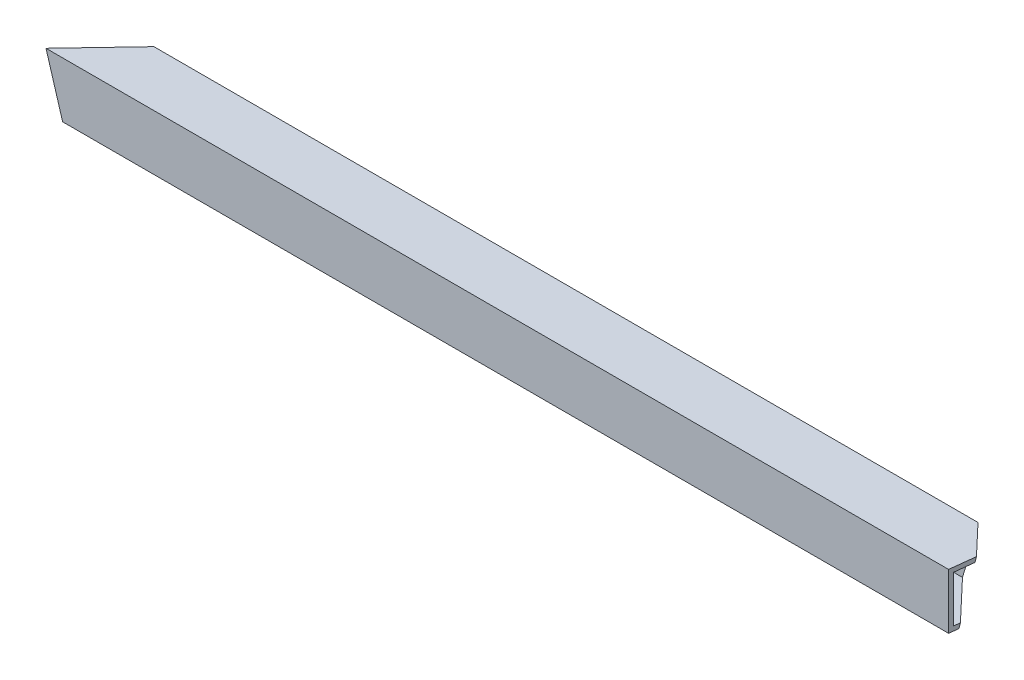
ISO-10303-21;
HEADER;
FILE_DESCRIPTION(('STEP AP214'),'2;1');
FILE_NAME('part.step','',(''),(''),'','','');
FILE_SCHEMA(('AUTOMOTIVE_DESIGN { 1 0 10303 214 1 1 1 1 }'));
ENDSEC;
DATA;
#1=APPLICATION_CONTEXT('core data for automotive mechanical design processes');
#2=APPLICATION_PROTOCOL_DEFINITION('international standard','automotive_design',2000,#1);
#3=PRODUCT_CONTEXT('',#1,'mechanical');
#4=PRODUCT('Part','Part','',(#3));
#5=PRODUCT_RELATED_PRODUCT_CATEGORY('part','',(#4));
#6=PRODUCT_DEFINITION_FORMATION('','',#4);
#7=PRODUCT_DEFINITION_CONTEXT('part definition',#1,'design');
#8=PRODUCT_DEFINITION('design','',#6,#7);
#9=PRODUCT_DEFINITION_SHAPE('','',#8);
#10=(LENGTH_UNIT() NAMED_UNIT(*) SI_UNIT(.MILLI.,.METRE.));
#11=(NAMED_UNIT(*) PLANE_ANGLE_UNIT() SI_UNIT($,.RADIAN.));
#12=(NAMED_UNIT(*) SI_UNIT($,.STERADIAN.) SOLID_ANGLE_UNIT());
#13=UNCERTAINTY_MEASURE_WITH_UNIT(LENGTH_MEASURE(1.E-05),#10,'distance_accuracy_value','');
#14=(GEOMETRIC_REPRESENTATION_CONTEXT(3) GLOBAL_UNCERTAINTY_ASSIGNED_CONTEXT((#13)) GLOBAL_UNIT_ASSIGNED_CONTEXT((#10,
#11,#12)) REPRESENTATION_CONTEXT('',''));
#15=CARTESIAN_POINT('',(0.,0.,0.));
#16=DIRECTION('',(0.,0.,1.));
#17=DIRECTION('',(1.,0.,0.));
#18=AXIS2_PLACEMENT_3D('',#15,#16,#17);
#19=CARTESIAN_POINT('',(-169.428571428572,-8.39999999999994,-986.599999999999));
#20=DIRECTION('',(0.,0.,-1.));
#21=DIRECTION('',(-1.,0.,0.));
#22=AXIS2_PLACEMENT_3D('',#19,#20,#21);
#23=PLANE('',#22);
#24=DIRECTION('',(1.,0.,0.));
#25=VECTOR('',#24,1.);
#26=CARTESIAN_POINT('',(-169.428571428572,8.40000000000004,-986.599999999999));
#27=LINE('',#26,#25);
#28=CARTESIAN_POINT('',(-165.813474674315,8.40000000000031,-986.599999999999));
#29=VERTEX_POINT('',#28);
#30=CARTESIAN_POINT('',(158.403477169252,8.4,-986.599999999999));
#31=VERTEX_POINT('',#30);
#32=EDGE_CURVE('E171',#29,#31,#27,.T.);
#33=ORIENTED_EDGE('',*,*,#32,.T.);
#34=DIRECTION('',(0.,-1.,0.));
#35=VECTOR('',#34,1.);
#36=CARTESIAN_POINT('',(158.403477169252,-8.39999999999994,-986.599999999999));
#37=LINE('',#36,#35);
#38=CARTESIAN_POINT('',(158.403477169252,-8.39999999999999,-986.599999999999));
#39=VERTEX_POINT('',#38);
#40=EDGE_CURVE('E202',#31,#39,#37,.T.);
#41=ORIENTED_EDGE('',*,*,#40,.T.);
#42=DIRECTION('',(1.,0.,0.));
#43=VECTOR('',#42,1.);
#44=CARTESIAN_POINT('',(-169.428571428572,-8.39999999999994,-986.599999999999));
#45=LINE('',#44,#43);
#46=CARTESIAN_POINT('',(-160.767070284621,-8.39999999999994,-986.599999999999));
#47=VERTEX_POINT('',#46);
#48=EDGE_CURVE('E167',#47,#39,#45,.T.);
#49=ORIENTED_EDGE('',*,*,#48,.F.);
#50=DIRECTION('',(-0.287682820424566,0.957725740926162,0.));
#51=VECTOR('',#50,1.);
#52=CARTESIAN_POINT('',(-161.483908290154,-6.01357244426472,-986.599999999999));
#53=LINE('',#52,#51);
#54=EDGE_CURVE('E142',#47,#29,#53,.T.);
#55=ORIENTED_EDGE('',*,*,#54,.T.);
#56=EDGE_LOOP('',(#33,#41,#49,#55));
#57=FACE_BOUND('',#56,.T.);
#58=ADVANCED_FACE('F41',(#57),#23,.T.);
#59=CARTESIAN_POINT('',(-169.428571428572,-8.39999999999994,-986.599999999999));
#60=DIRECTION('',(0.,1.,0.));
#61=DIRECTION('',(0.,0.,1.));
#62=AXIS2_PLACEMENT_3D('',#59,#60,#61);
#63=PLANE('',#62);
#64=ORIENTED_EDGE('',*,*,#48,.T.);
#65=DIRECTION('',(0.113546591160732,0.,-0.993532672656404));
#66=VECTOR('',#65,1.);
#67=CARTESIAN_POINT('',(154.176794834389,-8.39999999999993,-949.616529569947));
#68=LINE('',#67,#66);
#69=CARTESIAN_POINT('',(158.657556191653,-8.39999999999999,-988.823191446012));
#70=VERTEX_POINT('',#69);
#71=EDGE_CURVE('E134',#39,#70,#68,.T.);
#72=ORIENTED_EDGE('',*,*,#71,.T.);
#73=DIRECTION('',(-0.688317522845565,0.,-0.725409531053835));
#74=VECTOR('',#73,1.);
#75=CARTESIAN_POINT('',(4.32664491114096,-8.40000000000024,-1151.47067645596));
#76=LINE('',#75,#74);
#77=CARTESIAN_POINT('',(144.826096408793,-8.40000000000028,-1003.4));
#78=VERTEX_POINT('',#77);
#79=EDGE_CURVE('E132',#70,#78,#76,.T.);
#80=ORIENTED_EDGE('',*,*,#79,.T.);
#81=DIRECTION('',(1.,0.,0.));
#82=VECTOR('',#81,1.);
#83=CARTESIAN_POINT('',(-169.428571428572,-8.39999999999996,-1003.4));
#84=LINE('',#83,#82);
#85=CARTESIAN_POINT('',(-144.826096408794,-8.39999999999997,-1003.4));
#86=VERTEX_POINT('',#85);
#87=EDGE_CURVE('E164',#86,#78,#84,.T.);
#88=ORIENTED_EDGE('',*,*,#87,.F.);
#89=DIRECTION('',(-0.688317522845566,0.,0.725409531053835));
#90=VECTOR('',#89,1.);
#91=CARTESIAN_POINT('',(-164.870725064261,-8.39999999999993,-982.275207748599));
#92=LINE('',#91,#90);
#93=EDGE_CURVE('E177',#86,#47,#92,.T.);
#94=ORIENTED_EDGE('',*,*,#93,.T.);
#95=EDGE_LOOP('',(#64,#72,#80,#88,#94));
#96=FACE_BOUND('',#95,.T.);
#97=ADVANCED_FACE('F204',(#96),#63,.T.);
#98=CARTESIAN_POINT('',(164.469825921124,-6.31448757724577,-983.357917298473));
#99=DIRECTION('',(0.708778209555372,-0.212903658810694,-0.672536602516547));
#100=DIRECTION('',(-0.688317522845565,0.,-0.725409531053836));
#101=AXIS2_PLACEMENT_3D('',#98,#99,#100);
#102=PLANE('',#101);
#103=ORIENTED_EDGE('',*,*,#79,.F.);
#104=DIRECTION('',(-0.0310586126136646,-0.961862937380512,0.271762860369564));
#105=VECTOR('',#104,1.);
#106=CARTESIAN_POINT('',(158.679335720857,-7.72550361489242,-989.013762326542));
#107=LINE('',#106,#105);
#108=CARTESIAN_POINT('',(158.605892094566,-10.,-988.371130596495));
#109=VERTEX_POINT('',#108);
#110=EDGE_CURVE('E119',#70,#109,#107,.T.);
#111=ORIENTED_EDGE('',*,*,#110,.T.);
#112=DIRECTION('',(-0.688317522845565,0.,-0.725409531053836));
#113=VECTOR('',#112,1.);
#114=CARTESIAN_POINT('',(4.8726381803694,-9.99999999999998,-1150.38875172031));
#115=LINE('',#114,#113);
#116=CARTESIAN_POINT('',(142.827298478744,-10.,-1005.));
#117=VERTEX_POINT('',#116);
#118=EDGE_CURVE('E130',#109,#117,#115,.T.);
#119=ORIENTED_EDGE('',*,*,#118,.T.);
#120=DIRECTION('',(0.287682820424565,0.957725740926163,0.));
#121=VECTOR('',#120,1.);
#122=CARTESIAN_POINT('',(116.984563913435,-96.0331252057093,-1005.));
#123=LINE('',#122,#121);
#124=CARTESIAN_POINT('',(148.834922752189,10.,-1005.));
#125=VERTEX_POINT('',#124);
#126=EDGE_CURVE('E63',#117,#125,#123,.T.);
#127=ORIENTED_EDGE('',*,*,#126,.T.);
#128=DIRECTION('',(0.688317522845565,0.,0.725409531053836));
#129=VECTOR('',#128,1.);
#130=CARTESIAN_POINT('',(8.0339641442865,10.,-1153.38843116101));
#131=LINE('',#130,#129);
#132=CARTESIAN_POINT('',(159.251693308162,10.,-994.021891215459));
#133=VERTEX_POINT('',#132);
#134=EDGE_CURVE('E133',#125,#133,#131,.T.);
#135=ORIENTED_EDGE('',*,*,#134,.T.);
#136=DIRECTION('',(-0.0310586126136646,-0.961862937380512,0.271762860369564));
#137=VECTOR('',#136,1.);
#138=CARTESIAN_POINT('',(159.177930163519,7.71560836090497,-993.376463699835));
#139=LINE('',#138,#137);
#140=CARTESIAN_POINT('',(159.200029211074,8.4,-993.569830365942));
#141=VERTEX_POINT('',#140);
#142=EDGE_CURVE('E55',#133,#141,#139,.T.);
#143=ORIENTED_EDGE('',*,*,#142,.T.);
#144=DIRECTION('',(0.688317522845565,0.,0.725409531053836));
#145=VECTOR('',#144,1.);
#146=CARTESIAN_POINT('',(6.98215872083141,8.40000000000002,-1153.99040718615));
#147=LINE('',#146,#145);
#148=CARTESIAN_POINT('',(149.872500798487,8.39999999999999,-1003.4));
#149=VERTEX_POINT('',#148);
#150=EDGE_CURVE('E140',#149,#141,#147,.T.);
#151=ORIENTED_EDGE('',*,*,#150,.F.);
#152=DIRECTION('',(0.287682820424565,0.957725740926163,0.));
#153=VECTOR('',#152,1.);
#154=CARTESIAN_POINT('',(118.817938518148,-94.9838364945889,-1003.4));
#155=LINE('',#154,#153);
#156=EDGE_CURVE('E49',#78,#149,#155,.T.);
#157=ORIENTED_EDGE('',*,*,#156,.F.);
#158=EDGE_LOOP('',(#103,#111,#119,#127,#135,#143,#151,#157));
#159=FACE_BOUND('',#158,.T.);
#160=ADVANCED_FACE('F129',(#159),#102,.T.);
#161=CARTESIAN_POINT('',(-169.428571428572,8.40000000000004,-986.599999999999));
#162=DIRECTION('',(0.,-1.,0.));
#163=DIRECTION('',(1.,0.,0.));
#164=AXIS2_PLACEMENT_3D('',#161,#162,#163);
#165=PLANE('',#164);
#166=ORIENTED_EDGE('',*,*,#150,.T.);
#167=DIRECTION('',(-0.113546591160732,0.,0.993532672656404));
#168=VECTOR('',#167,1.);
#169=CARTESIAN_POINT('',(154.176794834389,8.4,-949.616529569947));
#170=LINE('',#169,#168);
#171=EDGE_CURVE('E209',#141,#31,#170,.T.);
#172=ORIENTED_EDGE('',*,*,#171,.T.);
#173=ORIENTED_EDGE('',*,*,#32,.F.);
#174=DIRECTION('',(0.688317522845566,0.,-0.725409531053835));
#175=VECTOR('',#174,1.);
#176=CARTESIAN_POINT('',(-167.526238873951,8.40000000000004,-984.794938478788));
#177=LINE('',#176,#175);
#178=CARTESIAN_POINT('',(-149.872500798488,8.40000000000004,-1003.4));
#179=VERTEX_POINT('',#178);
#180=EDGE_CURVE('E150',#29,#179,#177,.T.);
#181=ORIENTED_EDGE('',*,*,#180,.T.);
#182=DIRECTION('',(1.,0.,0.));
#183=VECTOR('',#182,1.);
#184=CARTESIAN_POINT('',(-169.428571428572,8.40000000000004,-1003.4));
#185=LINE('',#184,#183);
#186=EDGE_CURVE('E174',#179,#149,#185,.T.);
#187=ORIENTED_EDGE('',*,*,#186,.T.);
#188=EDGE_LOOP('',(#166,#172,#173,#181,#187));
#189=FACE_BOUND('',#188,.T.);
#190=ADVANCED_FACE('F193',(#189),#165,.T.);
#191=CARTESIAN_POINT('',(-169.428571428572,-9.99999999999996,-984.999999999999));
#192=DIRECTION('',(0.,1.,0.));
#193=DIRECTION('',(-1.,0.,0.));
#194=AXIS2_PLACEMENT_3D('',#191,#192,#193);
#195=PLANE('',#194);
#196=DIRECTION('',(-0.113546591160732,0.,0.993532672656404));
#197=VECTOR('',#196,1.);
#198=CARTESIAN_POINT('',(240.064673273436,-10.,-1701.13546591161));
#199=LINE('',#198,#197);
#200=CARTESIAN_POINT('',(158.220620026395,-10.,-984.999999999999));
#201=VERTEX_POINT('',#200);
#202=EDGE_CURVE('E116',#109,#201,#199,.T.);
#203=ORIENTED_EDGE('',*,*,#202,.T.);
#204=DIRECTION('',(1.,0.,0.));
#205=VECTOR('',#204,1.);
#206=CARTESIAN_POINT('',(-169.428571428572,-9.99999999999996,-984.999999999999));
#207=LINE('',#206,#205);
#208=CARTESIAN_POINT('',(-161.80464833092,-9.99999999999996,-984.999999999999));
#209=VERTEX_POINT('',#208);
#210=EDGE_CURVE('E168',#209,#201,#207,.T.);
#211=ORIENTED_EDGE('',*,*,#210,.F.);
#212=DIRECTION('',(-0.688317522845566,0.,0.725409531053835));
#213=VECTOR('',#212,1.);
#214=CARTESIAN_POINT('',(-165.416718333489,-9.99999999999996,-981.193283012953));
#215=LINE('',#214,#213);
#216=CARTESIAN_POINT('',(-142.827298478744,-10.,-1005.));
#217=VERTEX_POINT('',#216);
#218=EDGE_CURVE('E158',#217,#209,#215,.T.);
#219=ORIENTED_EDGE('',*,*,#218,.F.);
#220=DIRECTION('',(1.,0.,0.));
#221=VECTOR('',#220,1.);
#222=CARTESIAN_POINT('',(-169.428571428572,-9.99999999999996,-1005.));
#223=LINE('',#222,#221);
#224=EDGE_CURVE('E139',#217,#117,#223,.T.);
#225=ORIENTED_EDGE('',*,*,#224,.T.);
#226=ORIENTED_EDGE('',*,*,#118,.F.);
#227=EDGE_LOOP('',(#203,#211,#219,#225,#226));
#228=FACE_BOUND('',#227,.T.);
#229=ADVANCED_FACE('F43',(#228),#195,.F.);
#230=CARTESIAN_POINT('',(-169.428571428572,-9.99999999999996,-984.999999999999));
#231=DIRECTION('',(0.,0.,-1.));
#232=DIRECTION('',(-1.,0.,0.));
#233=AXIS2_PLACEMENT_3D('',#230,#231,#232);
#234=PLANE('',#233);
#235=DIRECTION('',(0.,-1.,0.));
#236=VECTOR('',#235,1.);
#237=CARTESIAN_POINT('',(158.220620026395,-9.99999999999996,-984.999999999999));
#238=LINE('',#237,#236);
#239=CARTESIAN_POINT('',(158.220620026395,10.,-984.999999999999));
#240=VERTEX_POINT('',#239);
#241=EDGE_CURVE('E122',#240,#201,#238,.T.);
#242=ORIENTED_EDGE('',*,*,#241,.F.);
#243=DIRECTION('',(1.,0.,0.));
#244=VECTOR('',#243,1.);
#245=CARTESIAN_POINT('',(-169.428571428572,10.0000000000001,-984.999999999999));
#246=LINE('',#245,#244);
#247=CARTESIAN_POINT('',(-167.812272604365,10.0000000000001,-984.999999999999));
#248=VERTEX_POINT('',#247);
#249=EDGE_CURVE('E182',#248,#240,#246,.T.);
#250=ORIENTED_EDGE('',*,*,#249,.F.);
#251=DIRECTION('',(-0.287682820424566,0.957725740926162,0.));
#252=VECTOR('',#251,1.);
#253=CARTESIAN_POINT('',(-162.43561491937,-7.89944723660855,-984.999999999999));
#254=LINE('',#253,#252);
#255=EDGE_CURVE('E162',#209,#248,#254,.T.);
#256=ORIENTED_EDGE('',*,*,#255,.F.);
#257=ORIENTED_EDGE('',*,*,#210,.T.);
#258=EDGE_LOOP('',(#242,#250,#256,#257));
#259=FACE_BOUND('',#258,.T.);
#260=ADVANCED_FACE('F221',(#259),#234,.F.);
#261=CARTESIAN_POINT('',(-169.428571428572,10.0000000000001,-984.999999999999));
#262=DIRECTION('',(0.,-1.,0.));
#263=DIRECTION('',(1.,0.,0.));
#264=AXIS2_PLACEMENT_3D('',#261,#262,#263);
#265=PLANE('',#264);
#266=DIRECTION('',(-0.113546591160732,0.,0.993532672656404));
#267=VECTOR('',#266,1.);
#268=CARTESIAN_POINT('',(153.99629523729,10.,-948.037158095329));
#269=LINE('',#268,#267);
#270=EDGE_CURVE('E11',#133,#240,#269,.T.);
#271=ORIENTED_EDGE('',*,*,#270,.F.);
#272=ORIENTED_EDGE('',*,*,#134,.F.);
#273=DIRECTION('',(1.,0.,0.));
#274=VECTOR('',#273,1.);
#275=CARTESIAN_POINT('',(-169.428571428572,10.0000000000001,-1005.));
#276=LINE('',#275,#274);
#277=CARTESIAN_POINT('',(-148.834922752189,10.0000000000003,-1005.));
#278=VERTEX_POINT('',#277);
#279=EDGE_CURVE('E179',#278,#125,#276,.T.);
#280=ORIENTED_EDGE('',*,*,#279,.F.);
#281=DIRECTION('',(0.688317522845566,0.,-0.725409531053835));
#282=VECTOR('',#281,1.);
#283=CARTESIAN_POINT('',(-168.578044297406,10.0000000000001,-984.192962453655));
#284=LINE('',#283,#282);
#285=EDGE_CURVE('E160',#248,#278,#284,.T.);
#286=ORIENTED_EDGE('',*,*,#285,.F.);
#287=ORIENTED_EDGE('',*,*,#249,.T.);
#288=EDGE_LOOP('',(#271,#272,#280,#286,#287));
#289=FACE_BOUND('',#288,.T.);
#290=ADVANCED_FACE('F214',(#289),#265,.F.);
#291=CARTESIAN_POINT('',(-164.469825921125,-6.31448757724561,-983.357917298473));
#292=DIRECTION('',(-0.708778209555371,-0.212903658810695,-0.672536602516548));
#293=DIRECTION('',(-0.688317522845566,0.,0.725409531053835));
#294=AXIS2_PLACEMENT_3D('',#291,#292,#293);
#295=PLANE('',#294);
#296=DIRECTION('',(0.287682820424566,-0.957725740926162,0.));
#297=VECTOR('',#296,1.);
#298=CARTESIAN_POINT('',(-146.862231812027,-1.62149551784191,-1003.4));
#299=LINE('',#298,#297);
#300=EDGE_CURVE('E153',#179,#86,#299,.T.);
#301=ORIENTED_EDGE('',*,*,#300,.F.);
#302=ORIENTED_EDGE('',*,*,#180,.F.);
#303=ORIENTED_EDGE('',*,*,#54,.F.);
#304=ORIENTED_EDGE('',*,*,#93,.F.);
#305=EDGE_LOOP('',(#301,#302,#303,#304));
#306=FACE_BOUND('',#305,.T.);
#307=ORIENTED_EDGE('',*,*,#255,.T.);
#308=ORIENTED_EDGE('',*,*,#285,.T.);
#309=DIRECTION('',(0.287682820424566,-0.957725740926162,0.));
#310=VECTOR('',#309,1.);
#311=CARTESIAN_POINT('',(-145.028857207314,-2.67078422896229,-1005.));
#312=LINE('',#311,#310);
#313=EDGE_CURVE('E156',#278,#217,#312,.T.);
#314=ORIENTED_EDGE('',*,*,#313,.T.);
#315=ORIENTED_EDGE('',*,*,#218,.T.);
#316=EDGE_LOOP('',(#307,#308,#314,#315));
#317=FACE_BOUND('',#316,.T.);
#318=ADVANCED_FACE('F197',(#306,#317),#295,.T.);
#319=CARTESIAN_POINT('',(-169.428571428572,-8.39999999999996,-1003.4));
#320=DIRECTION('',(0.,0.,1.));
#321=DIRECTION('',(1.,0.,0.));
#322=AXIS2_PLACEMENT_3D('',#319,#320,#321);
#323=PLANE('',#322);
#324=ORIENTED_EDGE('',*,*,#156,.T.);
#325=ORIENTED_EDGE('',*,*,#186,.F.);
#326=ORIENTED_EDGE('',*,*,#300,.T.);
#327=ORIENTED_EDGE('',*,*,#87,.T.);
#328=EDGE_LOOP('',(#324,#325,#326,#327));
#329=FACE_BOUND('',#328,.T.);
#330=ADVANCED_FACE('F190',(#329),#323,.T.);
#331=CARTESIAN_POINT('',(-169.428571428572,-9.99999999999996,-1005.));
#332=DIRECTION('',(0.,0.,1.));
#333=DIRECTION('',(1.,0.,0.));
#334=AXIS2_PLACEMENT_3D('',#331,#332,#333);
#335=PLANE('',#334);
#336=ORIENTED_EDGE('',*,*,#279,.T.);
#337=ORIENTED_EDGE('',*,*,#126,.F.);
#338=ORIENTED_EDGE('',*,*,#224,.F.);
#339=ORIENTED_EDGE('',*,*,#313,.F.);
#340=EDGE_LOOP('',(#336,#337,#338,#339));
#341=FACE_BOUND('',#340,.T.);
#342=ADVANCED_FACE('F218',(#341),#335,.F.);
#343=CARTESIAN_POINT('',(240.064673273436,10.,-1701.13546591161));
#344=DIRECTION('',(0.993532672656404,0.,0.113546591160732));
#345=DIRECTION('',(0.113546591160732,0.,-0.993532672656404));
#346=AXIS2_PLACEMENT_3D('',#343,#344,#345);
#347=PLANE('',#346);
#348=ORIENTED_EDGE('',*,*,#71,.F.);
#349=ORIENTED_EDGE('',*,*,#40,.F.);
#350=ORIENTED_EDGE('',*,*,#171,.F.);
#351=ORIENTED_EDGE('',*,*,#142,.F.);
#352=ORIENTED_EDGE('',*,*,#270,.T.);
#353=ORIENTED_EDGE('',*,*,#241,.T.);
#354=ORIENTED_EDGE('',*,*,#202,.F.);
#355=ORIENTED_EDGE('',*,*,#110,.F.);
#356=EDGE_LOOP('',(#348,#349,#350,#351,#352,#353,#354,#355));
#357=FACE_BOUND('',#356,.T.);
#358=ADVANCED_FACE('F118',(#357),#347,.T.);
#359=CLOSED_SHELL('',(#58,#97,#160,#190,#229,#260,#290,#318,#330,#342,#358));
#360=MANIFOLD_SOLID_BREP('B2',#359);
#361=ADVANCED_BREP_SHAPE_REPRESENTATION('',(#18,#360),#14);
#362=SHAPE_DEFINITION_REPRESENTATION(#9,#361);
ENDSEC;
END-ISO-10303-21;
